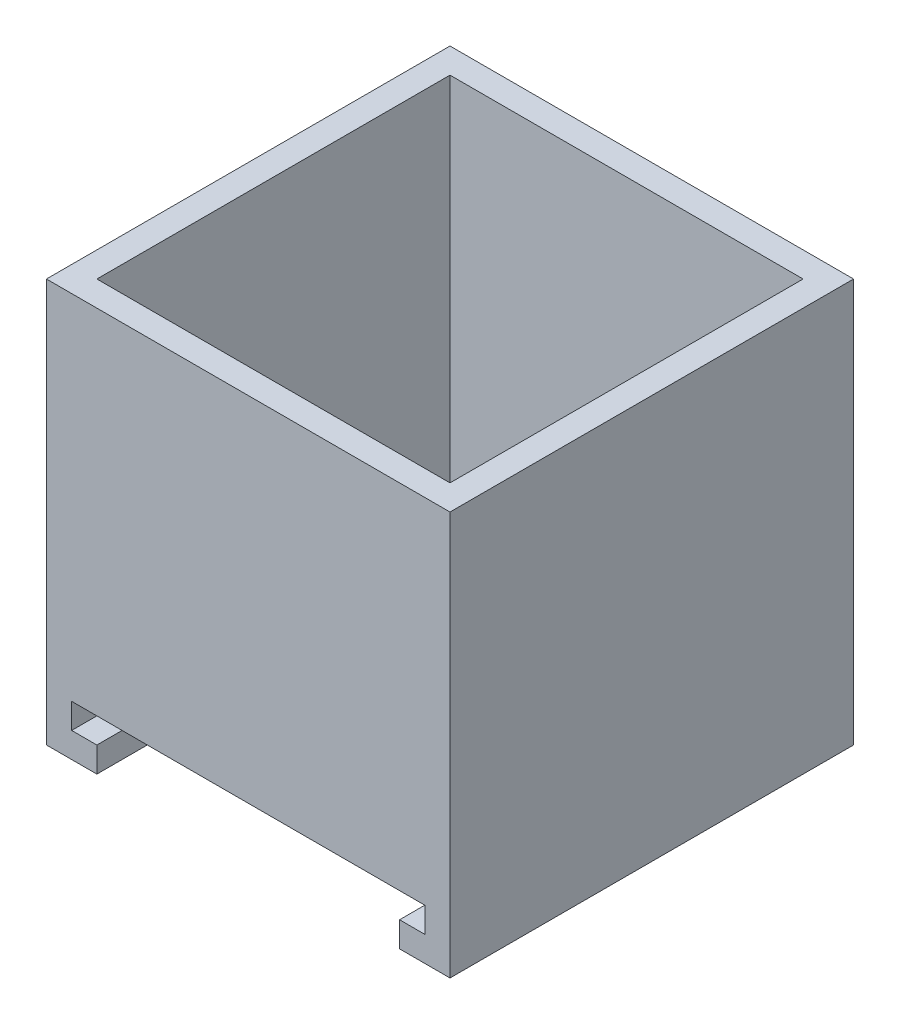
ISO-10303-21;
HEADER;
FILE_DESCRIPTION(('STEP AP214'),'2;1');
FILE_NAME('part.step','',(''),(''),'','','');
FILE_SCHEMA(('AUTOMOTIVE_DESIGN { 1 0 10303 214 1 1 1 1 }'));
ENDSEC;
DATA;
#1=APPLICATION_CONTEXT('core data for automotive mechanical design processes');
#2=APPLICATION_PROTOCOL_DEFINITION('international standard','automotive_design',2000,#1);
#3=PRODUCT_CONTEXT('',#1,'mechanical');
#4=PRODUCT('Part','Part','',(#3));
#5=PRODUCT_RELATED_PRODUCT_CATEGORY('part','',(#4));
#6=PRODUCT_DEFINITION_FORMATION('','',#4);
#7=PRODUCT_DEFINITION_CONTEXT('part definition',#1,'design');
#8=PRODUCT_DEFINITION('design','',#6,#7);
#9=PRODUCT_DEFINITION_SHAPE('','',#8);
#10=(LENGTH_UNIT() NAMED_UNIT(*) SI_UNIT(.MILLI.,.METRE.));
#11=(NAMED_UNIT(*) PLANE_ANGLE_UNIT() SI_UNIT($,.RADIAN.));
#12=(NAMED_UNIT(*) SI_UNIT($,.STERADIAN.) SOLID_ANGLE_UNIT());
#13=UNCERTAINTY_MEASURE_WITH_UNIT(LENGTH_MEASURE(1.E-05),#10,'distance_accuracy_value','');
#14=(GEOMETRIC_REPRESENTATION_CONTEXT(3) GLOBAL_UNCERTAINTY_ASSIGNED_CONTEXT((#13)) GLOBAL_UNIT_ASSIGNED_CONTEXT((#10,
#11,#12)) REPRESENTATION_CONTEXT('',''));
#15=CARTESIAN_POINT('',(0.,0.,0.));
#16=DIRECTION('',(0.,0.,1.));
#17=DIRECTION('',(1.,0.,0.));
#18=AXIS2_PLACEMENT_3D('',#15,#16,#17);
#19=CARTESIAN_POINT('',(0.,9.99999999999998,-34.));
#20=DIRECTION('',(0.,-1.,0.));
#21=DIRECTION('',(0.,0.,-1.));
#22=AXIS2_PLACEMENT_3D('',#19,#20,#21);
#23=PLANE('',#22);
#24=DIRECTION('',(-1.,0.,0.));
#25=VECTOR('',#24,1.);
#26=CARTESIAN_POINT('',(-75.,9.99999999999998,5.));
#27=LINE('',#26,#25);
#28=CARTESIAN_POINT('',(-5.,9.99999999999998,4.99999999999999));
#29=VERTEX_POINT('',#28);
#30=CARTESIAN_POINT('',(-75.,9.99999999999998,5.));
#31=VERTEX_POINT('',#30);
#32=EDGE_CURVE('E56',#29,#31,#27,.T.);
#33=ORIENTED_EDGE('',*,*,#32,.T.);
#34=DIRECTION('',(0.,0.,1.));
#35=VECTOR('',#34,1.);
#36=CARTESIAN_POINT('',(-75.,9.99999999999998,-34.));
#37=LINE('',#36,#35);
#38=CARTESIAN_POINT('',(-75.,9.99999999999998,0.));
#39=VERTEX_POINT('',#38);
#40=EDGE_CURVE('E165',#39,#31,#37,.T.);
#41=ORIENTED_EDGE('',*,*,#40,.F.);
#42=DIRECTION('',(1.,0.,0.));
#43=VECTOR('',#42,1.);
#44=CARTESIAN_POINT('',(0.,9.99999999999998,0.));
#45=LINE('',#44,#43);
#46=CARTESIAN_POINT('',(-5.,9.99999999999998,0.));
#47=VERTEX_POINT('',#46);
#48=EDGE_CURVE('E221',#39,#47,#45,.T.);
#49=ORIENTED_EDGE('',*,*,#48,.T.);
#50=DIRECTION('',(0.,0.,1.));
#51=VECTOR('',#50,1.);
#52=CARTESIAN_POINT('',(-5.,9.99999999999998,-34.));
#53=LINE('',#52,#51);
#54=EDGE_CURVE('E166',#47,#29,#53,.T.);
#55=ORIENTED_EDGE('',*,*,#54,.T.);
#56=EDGE_LOOP('',(#33,#41,#49,#55));
#57=FACE_BOUND('',#56,.T.);
#58=ADVANCED_FACE('F33',(#57),#23,.T.);
#59=CARTESIAN_POINT('',(0.,0.,80.));
#60=DIRECTION('',(0.,1.,0.));
#61=DIRECTION('',(-1.,0.,0.));
#62=AXIS2_PLACEMENT_3D('',#59,#60,#61);
#63=PLANE('',#62);
#64=DIRECTION('',(0.,0.,1.));
#65=VECTOR('',#64,1.);
#66=CARTESIAN_POINT('',(-10.,0.,-34.));
#67=LINE('',#66,#65);
#68=CARTESIAN_POINT('',(-10.,0.,0.));
#69=VERTEX_POINT('',#68);
#70=CARTESIAN_POINT('',(-10.,0.,80.));
#71=VERTEX_POINT('',#70);
#72=EDGE_CURVE('E198',#69,#71,#67,.T.);
#73=ORIENTED_EDGE('',*,*,#72,.F.);
#74=DIRECTION('',(1.,0.,0.));
#75=VECTOR('',#74,1.);
#76=CARTESIAN_POINT('',(0.,0.,0.));
#77=LINE('',#76,#75);
#78=CARTESIAN_POINT('',(0.,0.,0.));
#79=VERTEX_POINT('',#78);
#80=EDGE_CURVE('E202',#69,#79,#77,.T.);
#81=ORIENTED_EDGE('',*,*,#80,.T.);
#82=DIRECTION('',(0.,0.,-1.));
#83=VECTOR('',#82,1.);
#84=CARTESIAN_POINT('',(0.,0.,80.));
#85=LINE('',#84,#83);
#86=CARTESIAN_POINT('',(0.,0.,80.));
#87=VERTEX_POINT('',#86);
#88=EDGE_CURVE('E193',#87,#79,#85,.T.);
#89=ORIENTED_EDGE('',*,*,#88,.F.);
#90=DIRECTION('',(1.,0.,0.));
#91=VECTOR('',#90,1.);
#92=CARTESIAN_POINT('',(0.,0.,80.));
#93=LINE('',#92,#91);
#94=EDGE_CURVE('E189',#71,#87,#93,.T.);
#95=ORIENTED_EDGE('',*,*,#94,.F.);
#96=EDGE_LOOP('',(#73,#81,#89,#95));
#97=FACE_BOUND('',#96,.T.);
#98=ADVANCED_FACE('F303',(#97),#63,.F.);
#99=DIRECTION('',(0.,0.,1.));
#100=VECTOR('',#99,1.);
#101=CARTESIAN_POINT('',(-70.,0.,-34.));
#102=LINE('',#101,#100);
#103=CARTESIAN_POINT('',(-70.,0.,0.));
#104=VERTEX_POINT('',#103);
#105=CARTESIAN_POINT('',(-70.,0.,80.));
#106=VERTEX_POINT('',#105);
#107=EDGE_CURVE('E233',#104,#106,#102,.T.);
#108=ORIENTED_EDGE('',*,*,#107,.T.);
#109=CARTESIAN_POINT('',(-80.,0.,80.));
#110=VERTEX_POINT('',#109);
#111=EDGE_CURVE('E190',#110,#106,#93,.T.);
#112=ORIENTED_EDGE('',*,*,#111,.F.);
#113=DIRECTION('',(0.,0.,-1.));
#114=VECTOR('',#113,1.);
#115=CARTESIAN_POINT('',(-80.,0.,80.));
#116=LINE('',#115,#114);
#117=CARTESIAN_POINT('',(-80.,0.,0.));
#118=VERTEX_POINT('',#117);
#119=EDGE_CURVE('E207',#110,#118,#116,.T.);
#120=ORIENTED_EDGE('',*,*,#119,.T.);
#121=EDGE_CURVE('E185',#118,#104,#77,.T.);
#122=ORIENTED_EDGE('',*,*,#121,.T.);
#123=EDGE_LOOP('',(#108,#112,#120,#122));
#124=FACE_BOUND('',#123,.T.);
#125=ADVANCED_FACE('F283',(#124),#63,.F.);
#126=CARTESIAN_POINT('',(0.,0.,80.));
#127=DIRECTION('',(0.,0.,1.));
#128=DIRECTION('',(1.,0.,0.));
#129=AXIS2_PLACEMENT_3D('',#126,#127,#128);
#130=PLANE('',#129);
#131=DIRECTION('',(-1.,0.,0.));
#132=VECTOR('',#131,1.);
#133=CARTESIAN_POINT('',(0.,4.99999999999999,80.));
#134=LINE('',#133,#132);
#135=CARTESIAN_POINT('',(-5.,4.99999999999999,80.));
#136=VERTEX_POINT('',#135);
#137=CARTESIAN_POINT('',(-10.,4.99999999999999,80.));
#138=VERTEX_POINT('',#137);
#139=EDGE_CURVE('E269',#136,#138,#134,.T.);
#140=ORIENTED_EDGE('',*,*,#139,.T.);
#141=DIRECTION('',(0.,-1.,0.));
#142=VECTOR('',#141,1.);
#143=CARTESIAN_POINT('',(-9.99999999999999,0.,80.));
#144=LINE('',#143,#142);
#145=EDGE_CURVE('E263',#138,#71,#144,.T.);
#146=ORIENTED_EDGE('',*,*,#145,.T.);
#147=ORIENTED_EDGE('',*,*,#94,.T.);
#148=DIRECTION('',(0.,1.,0.));
#149=VECTOR('',#148,1.);
#150=CARTESIAN_POINT('',(0.,0.,80.));
#151=LINE('',#150,#149);
#152=CARTESIAN_POINT('',(0.,80.,80.));
#153=VERTEX_POINT('',#152);
#154=EDGE_CURVE('E181',#87,#153,#151,.T.);
#155=ORIENTED_EDGE('',*,*,#154,.T.);
#156=DIRECTION('',(-1.,0.,0.));
#157=VECTOR('',#156,1.);
#158=CARTESIAN_POINT('',(0.,80.,80.));
#159=LINE('',#158,#157);
#160=CARTESIAN_POINT('',(-80.,80.,80.));
#161=VERTEX_POINT('',#160);
#162=EDGE_CURVE('E184',#153,#161,#159,.T.);
#163=ORIENTED_EDGE('',*,*,#162,.T.);
#164=DIRECTION('',(0.,-1.,0.));
#165=VECTOR('',#164,1.);
#166=CARTESIAN_POINT('',(-80.,0.,80.));
#167=LINE('',#166,#165);
#168=EDGE_CURVE('E187',#161,#110,#167,.T.);
#169=ORIENTED_EDGE('',*,*,#168,.T.);
#170=ORIENTED_EDGE('',*,*,#111,.T.);
#171=DIRECTION('',(0.,1.,0.));
#172=VECTOR('',#171,1.);
#173=CARTESIAN_POINT('',(-70.,0.,80.));
#174=LINE('',#173,#172);
#175=CARTESIAN_POINT('',(-70.,4.99999999999999,80.));
#176=VERTEX_POINT('',#175);
#177=EDGE_CURVE('E180',#106,#176,#174,.T.);
#178=ORIENTED_EDGE('',*,*,#177,.T.);
#179=DIRECTION('',(-1.,0.,0.));
#180=VECTOR('',#179,1.);
#181=CARTESIAN_POINT('',(0.,5.,80.));
#182=LINE('',#181,#180);
#183=CARTESIAN_POINT('',(-75.,4.99999999999999,80.));
#184=VERTEX_POINT('',#183);
#185=EDGE_CURVE('E241',#176,#184,#182,.T.);
#186=ORIENTED_EDGE('',*,*,#185,.T.);
#187=DIRECTION('',(0.,1.,0.));
#188=VECTOR('',#187,1.);
#189=CARTESIAN_POINT('',(-75.,0.,80.));
#190=LINE('',#189,#188);
#191=CARTESIAN_POINT('',(-75.,9.99999999999998,80.));
#192=VERTEX_POINT('',#191);
#193=EDGE_CURVE('E276',#184,#192,#190,.T.);
#194=ORIENTED_EDGE('',*,*,#193,.T.);
#195=DIRECTION('',(1.,0.,0.));
#196=VECTOR('',#195,1.);
#197=CARTESIAN_POINT('',(0.,9.99999999999998,80.));
#198=LINE('',#197,#196);
#199=CARTESIAN_POINT('',(-5.,9.99999999999998,80.));
#200=VERTEX_POINT('',#199);
#201=EDGE_CURVE('E163',#192,#200,#198,.T.);
#202=ORIENTED_EDGE('',*,*,#201,.T.);
#203=DIRECTION('',(0.,-1.,0.));
#204=VECTOR('',#203,1.);
#205=CARTESIAN_POINT('',(-4.99999999999999,0.,80.));
#206=LINE('',#205,#204);
#207=EDGE_CURVE('E272',#200,#136,#206,.T.);
#208=ORIENTED_EDGE('',*,*,#207,.T.);
#209=EDGE_LOOP('',(#140,#146,#147,#155,#163,#169,#170,#178,#186,#194,#202,#208));
#210=FACE_BOUND('',#209,.T.);
#211=ADVANCED_FACE('F285',(#210),#130,.T.);
#212=CARTESIAN_POINT('',(0.,0.,0.));
#213=DIRECTION('',(0.,0.,1.));
#214=DIRECTION('',(1.,0.,0.));
#215=AXIS2_PLACEMENT_3D('',#212,#213,#214);
#216=PLANE('',#215);
#217=DIRECTION('',(0.,-1.,0.));
#218=VECTOR('',#217,1.);
#219=CARTESIAN_POINT('',(-9.99999999999999,0.,0.));
#220=LINE('',#219,#218);
#221=CARTESIAN_POINT('',(-10.,4.99999999999999,0.));
#222=VERTEX_POINT('',#221);
#223=EDGE_CURVE('E11',#222,#69,#220,.T.);
#224=ORIENTED_EDGE('',*,*,#223,.F.);
#225=DIRECTION('',(-1.,0.,0.));
#226=VECTOR('',#225,1.);
#227=CARTESIAN_POINT('',(0.,4.99999999999999,0.));
#228=LINE('',#227,#226);
#229=CARTESIAN_POINT('',(-5.,4.99999999999999,0.));
#230=VERTEX_POINT('',#229);
#231=EDGE_CURVE('E216',#230,#222,#228,.T.);
#232=ORIENTED_EDGE('',*,*,#231,.F.);
#233=DIRECTION('',(0.,-1.,0.));
#234=VECTOR('',#233,1.);
#235=CARTESIAN_POINT('',(-4.99999999999999,0.,0.));
#236=LINE('',#235,#234);
#237=EDGE_CURVE('E218',#47,#230,#236,.T.);
#238=ORIENTED_EDGE('',*,*,#237,.F.);
#239=ORIENTED_EDGE('',*,*,#48,.F.);
#240=DIRECTION('',(0.,1.,0.));
#241=VECTOR('',#240,1.);
#242=CARTESIAN_POINT('',(-75.,0.,0.));
#243=LINE('',#242,#241);
#244=CARTESIAN_POINT('',(-75.,4.99999999999999,0.));
#245=VERTEX_POINT('',#244);
#246=EDGE_CURVE('E223',#245,#39,#243,.T.);
#247=ORIENTED_EDGE('',*,*,#246,.F.);
#248=DIRECTION('',(-1.,0.,0.));
#249=VECTOR('',#248,1.);
#250=CARTESIAN_POINT('',(0.,5.,0.));
#251=LINE('',#250,#249);
#252=CARTESIAN_POINT('',(-70.,4.99999999999999,0.));
#253=VERTEX_POINT('',#252);
#254=EDGE_CURVE('E225',#253,#245,#251,.T.);
#255=ORIENTED_EDGE('',*,*,#254,.F.);
#256=DIRECTION('',(0.,1.,0.));
#257=VECTOR('',#256,1.);
#258=CARTESIAN_POINT('',(-70.,0.,0.));
#259=LINE('',#258,#257);
#260=EDGE_CURVE('E41',#104,#253,#259,.T.);
#261=ORIENTED_EDGE('',*,*,#260,.F.);
#262=ORIENTED_EDGE('',*,*,#121,.F.);
#263=DIRECTION('',(0.,-1.,0.));
#264=VECTOR('',#263,1.);
#265=CARTESIAN_POINT('',(-80.,0.,0.));
#266=LINE('',#265,#264);
#267=CARTESIAN_POINT('',(-80.,80.,0.));
#268=VERTEX_POINT('',#267);
#269=EDGE_CURVE('E200',#268,#118,#266,.T.);
#270=ORIENTED_EDGE('',*,*,#269,.F.);
#271=DIRECTION('',(-1.,0.,0.));
#272=VECTOR('',#271,1.);
#273=CARTESIAN_POINT('',(0.,80.,0.));
#274=LINE('',#273,#272);
#275=CARTESIAN_POINT('',(0.,80.,0.));
#276=VERTEX_POINT('',#275);
#277=EDGE_CURVE('E197',#276,#268,#274,.T.);
#278=ORIENTED_EDGE('',*,*,#277,.F.);
#279=DIRECTION('',(0.,1.,0.));
#280=VECTOR('',#279,1.);
#281=CARTESIAN_POINT('',(0.,0.,0.));
#282=LINE('',#281,#280);
#283=EDGE_CURVE('E194',#79,#276,#282,.T.);
#284=ORIENTED_EDGE('',*,*,#283,.F.);
#285=ORIENTED_EDGE('',*,*,#80,.F.);
#286=EDGE_LOOP('',(#224,#232,#238,#239,#247,#255,#261,#262,#270,#278,#284,#285));
#287=FACE_BOUND('',#286,.T.);
#288=ADVANCED_FACE('F245',(#287),#216,.F.);
#289=CARTESIAN_POINT('',(0.,0.,80.));
#290=DIRECTION('',(-1.,0.,0.));
#291=DIRECTION('',(0.,0.,1.));
#292=AXIS2_PLACEMENT_3D('',#289,#290,#291);
#293=PLANE('',#292);
#294=ORIENTED_EDGE('',*,*,#283,.T.);
#295=DIRECTION('',(0.,0.,-1.));
#296=VECTOR('',#295,1.);
#297=CARTESIAN_POINT('',(0.,80.,80.));
#298=LINE('',#297,#296);
#299=EDGE_CURVE('E213',#153,#276,#298,.T.);
#300=ORIENTED_EDGE('',*,*,#299,.F.);
#301=ORIENTED_EDGE('',*,*,#154,.F.);
#302=ORIENTED_EDGE('',*,*,#88,.T.);
#303=EDGE_LOOP('',(#294,#300,#301,#302));
#304=FACE_BOUND('',#303,.T.);
#305=ADVANCED_FACE('F35',(#304),#293,.F.);
#306=CARTESIAN_POINT('',(0.,80.,80.));
#307=DIRECTION('',(0.,-1.,0.));
#308=DIRECTION('',(1.,0.,0.));
#309=AXIS2_PLACEMENT_3D('',#306,#307,#308);
#310=PLANE('',#309);
#311=DIRECTION('',(1.,0.,0.));
#312=VECTOR('',#311,1.);
#313=CARTESIAN_POINT('',(-75.,80.,75.));
#314=LINE('',#313,#312);
#315=CARTESIAN_POINT('',(-75.,80.,75.));
#316=VERTEX_POINT('',#315);
#317=CARTESIAN_POINT('',(-4.99999999999999,80.,75.));
#318=VERTEX_POINT('',#317);
#319=EDGE_CURVE('E254',#316,#318,#314,.T.);
#320=ORIENTED_EDGE('',*,*,#319,.F.);
#321=DIRECTION('',(0.,0.,1.));
#322=VECTOR('',#321,1.);
#323=CARTESIAN_POINT('',(-75.,80.,5.));
#324=LINE('',#323,#322);
#325=CARTESIAN_POINT('',(-75.,80.,5.));
#326=VERTEX_POINT('',#325);
#327=EDGE_CURVE('E48',#326,#316,#324,.T.);
#328=ORIENTED_EDGE('',*,*,#327,.F.);
#329=DIRECTION('',(-1.,0.,0.));
#330=VECTOR('',#329,1.);
#331=CARTESIAN_POINT('',(-75.,80.,5.));
#332=LINE('',#331,#330);
#333=CARTESIAN_POINT('',(-5.,80.,5.));
#334=VERTEX_POINT('',#333);
#335=EDGE_CURVE('E159',#334,#326,#332,.T.);
#336=ORIENTED_EDGE('',*,*,#335,.F.);
#337=DIRECTION('',(0.,0.,-1.));
#338=VECTOR('',#337,1.);
#339=CARTESIAN_POINT('',(-5.,80.,5.));
#340=LINE('',#339,#338);
#341=EDGE_CURVE('E256',#318,#334,#340,.T.);
#342=ORIENTED_EDGE('',*,*,#341,.F.);
#343=EDGE_LOOP('',(#320,#328,#336,#342));
#344=FACE_BOUND('',#343,.T.);
#345=ORIENTED_EDGE('',*,*,#277,.T.);
#346=DIRECTION('',(0.,0.,-1.));
#347=VECTOR('',#346,1.);
#348=CARTESIAN_POINT('',(-80.,80.,80.));
#349=LINE('',#348,#347);
#350=EDGE_CURVE('E210',#161,#268,#349,.T.);
#351=ORIENTED_EDGE('',*,*,#350,.F.);
#352=ORIENTED_EDGE('',*,*,#162,.F.);
#353=ORIENTED_EDGE('',*,*,#299,.T.);
#354=EDGE_LOOP('',(#345,#351,#352,#353));
#355=FACE_BOUND('',#354,.T.);
#356=ADVANCED_FACE('F296',(#344,#355),#310,.F.);
#357=CARTESIAN_POINT('',(-80.,0.,80.));
#358=DIRECTION('',(1.,0.,0.));
#359=DIRECTION('',(0.,0.,-1.));
#360=AXIS2_PLACEMENT_3D('',#357,#358,#359);
#361=PLANE('',#360);
#362=ORIENTED_EDGE('',*,*,#269,.T.);
#363=ORIENTED_EDGE('',*,*,#119,.F.);
#364=ORIENTED_EDGE('',*,*,#168,.F.);
#365=ORIENTED_EDGE('',*,*,#350,.T.);
#366=EDGE_LOOP('',(#362,#363,#364,#365));
#367=FACE_BOUND('',#366,.T.);
#368=ADVANCED_FACE('F290',(#367),#361,.F.);
#369=CARTESIAN_POINT('',(-9.99999999999999,0.,-34.));
#370=DIRECTION('',(-1.,0.,0.));
#371=DIRECTION('',(0.,-1.,0.));
#372=AXIS2_PLACEMENT_3D('',#369,#370,#371);
#373=PLANE('',#372);
#374=ORIENTED_EDGE('',*,*,#223,.T.);
#375=ORIENTED_EDGE('',*,*,#72,.T.);
#376=ORIENTED_EDGE('',*,*,#145,.F.);
#377=DIRECTION('',(0.,0.,1.));
#378=VECTOR('',#377,1.);
#379=CARTESIAN_POINT('',(-10.,4.99999999999999,-34.));
#380=LINE('',#379,#378);
#381=EDGE_CURVE('E178',#222,#138,#380,.T.);
#382=ORIENTED_EDGE('',*,*,#381,.F.);
#383=EDGE_LOOP('',(#374,#375,#376,#382));
#384=FACE_BOUND('',#383,.T.);
#385=ADVANCED_FACE('F307',(#384),#373,.T.);
#386=CARTESIAN_POINT('',(-70.,0.,-34.));
#387=DIRECTION('',(1.,0.,0.));
#388=DIRECTION('',(0.,0.,-1.));
#389=AXIS2_PLACEMENT_3D('',#386,#387,#388);
#390=PLANE('',#389);
#391=ORIENTED_EDGE('',*,*,#260,.T.);
#392=DIRECTION('',(0.,0.,1.));
#393=VECTOR('',#392,1.);
#394=CARTESIAN_POINT('',(-70.,4.99999999999999,-34.));
#395=LINE('',#394,#393);
#396=EDGE_CURVE('E230',#253,#176,#395,.T.);
#397=ORIENTED_EDGE('',*,*,#396,.T.);
#398=ORIENTED_EDGE('',*,*,#177,.F.);
#399=ORIENTED_EDGE('',*,*,#107,.F.);
#400=EDGE_LOOP('',(#391,#397,#398,#399));
#401=FACE_BOUND('',#400,.T.);
#402=ADVANCED_FACE('F229',(#401),#390,.T.);
#403=CARTESIAN_POINT('',(0.,5.,-34.));
#404=DIRECTION('',(0.,1.,0.));
#405=DIRECTION('',(-1.,0.,0.));
#406=AXIS2_PLACEMENT_3D('',#403,#404,#405);
#407=PLANE('',#406);
#408=ORIENTED_EDGE('',*,*,#254,.T.);
#409=DIRECTION('',(0.,0.,1.));
#410=VECTOR('',#409,1.);
#411=CARTESIAN_POINT('',(-75.,4.99999999999999,-34.));
#412=LINE('',#411,#410);
#413=EDGE_CURVE('E169',#245,#184,#412,.T.);
#414=ORIENTED_EDGE('',*,*,#413,.T.);
#415=ORIENTED_EDGE('',*,*,#185,.F.);
#416=ORIENTED_EDGE('',*,*,#396,.F.);
#417=EDGE_LOOP('',(#408,#414,#415,#416));
#418=FACE_BOUND('',#417,.T.);
#419=ADVANCED_FACE('F238',(#418),#407,.T.);
#420=CARTESIAN_POINT('',(-75.,0.,-34.));
#421=DIRECTION('',(1.,0.,0.));
#422=DIRECTION('',(0.,0.,-1.));
#423=AXIS2_PLACEMENT_3D('',#420,#421,#422);
#424=PLANE('',#423);
#425=ORIENTED_EDGE('',*,*,#246,.T.);
#426=ORIENTED_EDGE('',*,*,#40,.T.);
#427=DIRECTION('',(0.,1.,0.));
#428=VECTOR('',#427,1.);
#429=CARTESIAN_POINT('',(-75.,9.99999999999998,5.));
#430=LINE('',#429,#428);
#431=EDGE_CURVE('E261',#31,#326,#430,.T.);
#432=ORIENTED_EDGE('',*,*,#431,.T.);
#433=ORIENTED_EDGE('',*,*,#327,.T.);
#434=DIRECTION('',(0.,1.,0.));
#435=VECTOR('',#434,1.);
#436=CARTESIAN_POINT('',(-75.,9.99999999999998,75.));
#437=LINE('',#436,#435);
#438=CARTESIAN_POINT('',(-75.,9.99999999999998,75.));
#439=VERTEX_POINT('',#438);
#440=EDGE_CURVE('E142',#439,#316,#437,.T.);
#441=ORIENTED_EDGE('',*,*,#440,.F.);
#442=EDGE_CURVE('E147',#439,#192,#37,.T.);
#443=ORIENTED_EDGE('',*,*,#442,.T.);
#444=ORIENTED_EDGE('',*,*,#193,.F.);
#445=ORIENTED_EDGE('',*,*,#413,.F.);
#446=EDGE_LOOP('',(#425,#426,#432,#433,#441,#443,#444,#445));
#447=FACE_BOUND('',#446,.T.);
#448=ADVANCED_FACE('F144',(#447),#424,.T.);
#449=DIRECTION('',(1.,0.,0.));
#450=VECTOR('',#449,1.);
#451=CARTESIAN_POINT('',(-75.,9.99999999999998,75.));
#452=LINE('',#451,#450);
#453=CARTESIAN_POINT('',(-4.99999999999998,9.99999999999999,75.));
#454=VERTEX_POINT('',#453);
#455=EDGE_CURVE('E155',#439,#454,#452,.T.);
#456=ORIENTED_EDGE('',*,*,#455,.T.);
#457=EDGE_CURVE('E171',#454,#200,#53,.T.);
#458=ORIENTED_EDGE('',*,*,#457,.T.);
#459=ORIENTED_EDGE('',*,*,#201,.F.);
#460=ORIENTED_EDGE('',*,*,#442,.F.);
#461=EDGE_LOOP('',(#456,#458,#459,#460));
#462=FACE_BOUND('',#461,.T.);
#463=ADVANCED_FACE('F161',(#462),#23,.T.);
#464=CARTESIAN_POINT('',(-4.99999999999999,0.,-34.));
#465=DIRECTION('',(-1.,0.,0.));
#466=DIRECTION('',(0.,-1.,0.));
#467=AXIS2_PLACEMENT_3D('',#464,#465,#466);
#468=PLANE('',#467);
#469=ORIENTED_EDGE('',*,*,#237,.T.);
#470=DIRECTION('',(0.,0.,1.));
#471=VECTOR('',#470,1.);
#472=CARTESIAN_POINT('',(-5.,4.99999999999999,-34.));
#473=LINE('',#472,#471);
#474=EDGE_CURVE('E176',#230,#136,#473,.T.);
#475=ORIENTED_EDGE('',*,*,#474,.T.);
#476=ORIENTED_EDGE('',*,*,#207,.F.);
#477=ORIENTED_EDGE('',*,*,#457,.F.);
#478=DIRECTION('',(0.,1.,0.));
#479=VECTOR('',#478,1.);
#480=CARTESIAN_POINT('',(-4.99999999999998,9.99999999999999,75.));
#481=LINE('',#480,#479);
#482=EDGE_CURVE('E152',#454,#318,#481,.T.);
#483=ORIENTED_EDGE('',*,*,#482,.T.);
#484=ORIENTED_EDGE('',*,*,#341,.T.);
#485=DIRECTION('',(0.,1.,0.));
#486=VECTOR('',#485,1.);
#487=CARTESIAN_POINT('',(-4.99999999999999,9.99999999999999,5.));
#488=LINE('',#487,#486);
#489=EDGE_CURVE('E264',#29,#334,#488,.T.);
#490=ORIENTED_EDGE('',*,*,#489,.F.);
#491=ORIENTED_EDGE('',*,*,#54,.F.);
#492=EDGE_LOOP('',(#469,#475,#476,#477,#483,#484,#490,#491));
#493=FACE_BOUND('',#492,.T.);
#494=ADVANCED_FACE('F314',(#493),#468,.T.);
#495=CARTESIAN_POINT('',(0.,4.99999999999999,-34.));
#496=DIRECTION('',(0.,1.,0.));
#497=DIRECTION('',(-1.,0.,0.));
#498=AXIS2_PLACEMENT_3D('',#495,#496,#497);
#499=PLANE('',#498);
#500=ORIENTED_EDGE('',*,*,#231,.T.);
#501=ORIENTED_EDGE('',*,*,#381,.T.);
#502=ORIENTED_EDGE('',*,*,#139,.F.);
#503=ORIENTED_EDGE('',*,*,#474,.F.);
#504=EDGE_LOOP('',(#500,#501,#502,#503));
#505=FACE_BOUND('',#504,.T.);
#506=ADVANCED_FACE('F311',(#505),#499,.T.);
#507=CARTESIAN_POINT('',(-75.,9.99999999999998,5.));
#508=DIRECTION('',(0.,0.,-1.));
#509=DIRECTION('',(-1.,0.,0.));
#510=AXIS2_PLACEMENT_3D('',#507,#508,#509);
#511=PLANE('',#510);
#512=ORIENTED_EDGE('',*,*,#335,.T.);
#513=ORIENTED_EDGE('',*,*,#431,.F.);
#514=ORIENTED_EDGE('',*,*,#32,.F.);
#515=ORIENTED_EDGE('',*,*,#489,.T.);
#516=EDGE_LOOP('',(#512,#513,#514,#515));
#517=FACE_BOUND('',#516,.T.);
#518=ADVANCED_FACE('F317',(#517),#511,.F.);
#519=CARTESIAN_POINT('',(-75.,9.99999999999998,75.));
#520=DIRECTION('',(0.,0.,1.));
#521=DIRECTION('',(1.,0.,0.));
#522=AXIS2_PLACEMENT_3D('',#519,#520,#521);
#523=PLANE('',#522);
#524=ORIENTED_EDGE('',*,*,#319,.T.);
#525=ORIENTED_EDGE('',*,*,#482,.F.);
#526=ORIENTED_EDGE('',*,*,#455,.F.);
#527=ORIENTED_EDGE('',*,*,#440,.T.);
#528=EDGE_LOOP('',(#524,#525,#526,#527));
#529=FACE_BOUND('',#528,.T.);
#530=ADVANCED_FACE('F156',(#529),#523,.F.);
#531=CLOSED_SHELL('',(#58,#98,#125,#211,#288,#305,#356,#368,#385,#402,#419,#448,#463,#494,#506,
#518,#530));
#532=MANIFOLD_SOLID_BREP('B2',#531);
#533=ADVANCED_BREP_SHAPE_REPRESENTATION('',(#18,#532),#14);
#534=SHAPE_DEFINITION_REPRESENTATION(#9,#533);
ENDSEC;
END-ISO-10303-21;
